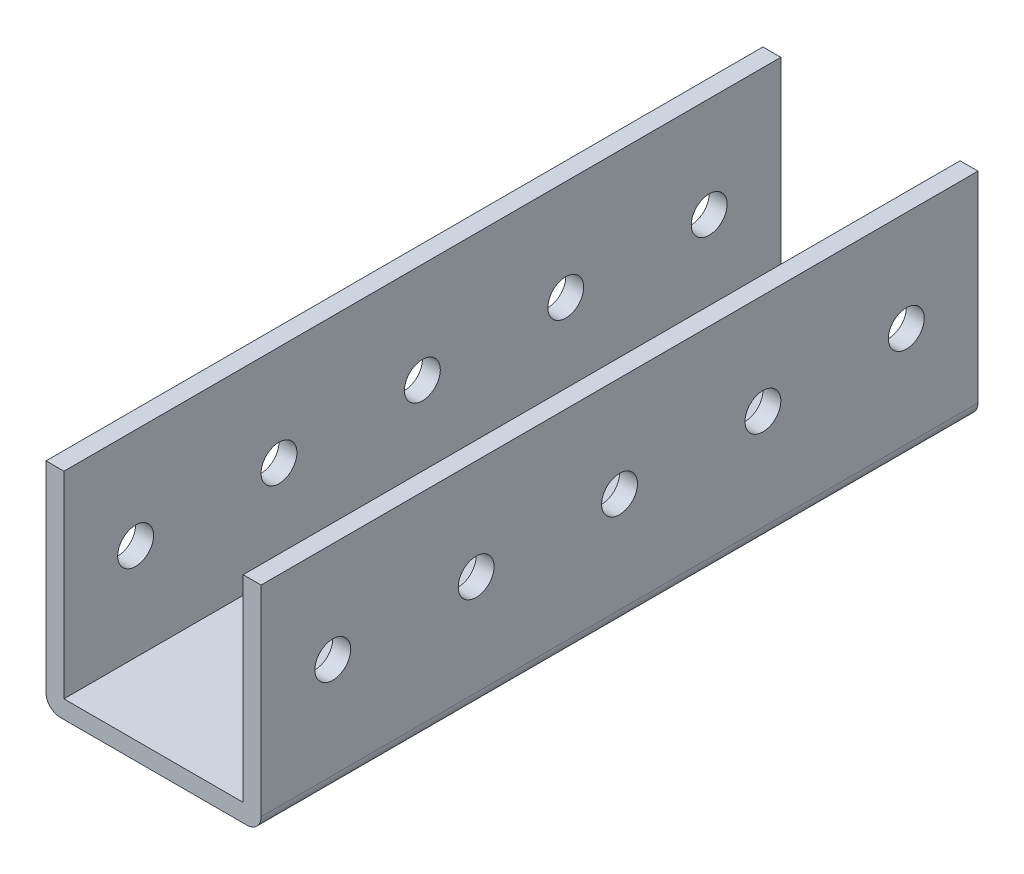
ISO-10303-21;
HEADER;
FILE_DESCRIPTION(('STEP AP214'),'2;1');
FILE_NAME('part.step','',(''),(''),'','','');
FILE_SCHEMA(('AUTOMOTIVE_DESIGN { 1 0 10303 214 1 1 1 1 }'));
ENDSEC;
DATA;
#1=APPLICATION_CONTEXT('core data for automotive mechanical design processes');
#2=APPLICATION_PROTOCOL_DEFINITION('international standard','automotive_design',2000,#1);
#3=PRODUCT_CONTEXT('',#1,'mechanical');
#4=PRODUCT('Part','Part','',(#3));
#5=PRODUCT_RELATED_PRODUCT_CATEGORY('part','',(#4));
#6=PRODUCT_DEFINITION_FORMATION('','',#4);
#7=PRODUCT_DEFINITION_CONTEXT('part definition',#1,'design');
#8=PRODUCT_DEFINITION('design','',#6,#7);
#9=PRODUCT_DEFINITION_SHAPE('','',#8);
#10=(LENGTH_UNIT() NAMED_UNIT(*) SI_UNIT(.MILLI.,.METRE.));
#11=(NAMED_UNIT(*) PLANE_ANGLE_UNIT() SI_UNIT($,.RADIAN.));
#12=(NAMED_UNIT(*) SI_UNIT($,.STERADIAN.) SOLID_ANGLE_UNIT());
#13=UNCERTAINTY_MEASURE_WITH_UNIT(LENGTH_MEASURE(1.E-05),#10,'distance_accuracy_value','');
#14=(GEOMETRIC_REPRESENTATION_CONTEXT(3) GLOBAL_UNCERTAINTY_ASSIGNED_CONTEXT((#13)) GLOBAL_UNIT_ASSIGNED_CONTEXT((#10,
#11,#12)) REPRESENTATION_CONTEXT('',''));
#15=CARTESIAN_POINT('',(0.,0.,0.));
#16=DIRECTION('',(0.,0.,1.));
#17=DIRECTION('',(1.,0.,0.));
#18=AXIS2_PLACEMENT_3D('',#15,#16,#17);
#19=CARTESIAN_POINT('',(0.,38.1,0.));
#20=DIRECTION('',(0.,-1.,0.));
#21=DIRECTION('',(0.,0.,-1.));
#22=AXIS2_PLACEMENT_3D('',#19,#20,#21);
#23=PLANE('',#22);
#24=DIRECTION('',(1.,0.,0.));
#25=VECTOR('',#24,1.);
#26=CARTESIAN_POINT('',(-19.05,38.1,63.5));
#27=LINE('',#26,#25);
#28=CARTESIAN_POINT('',(-19.05,38.1,63.5));
#29=VERTEX_POINT('',#28);
#30=CARTESIAN_POINT('',(-15.875,38.1,63.5));
#31=VERTEX_POINT('',#30);
#32=EDGE_CURVE('E164',#29,#31,#27,.T.);
#33=ORIENTED_EDGE('',*,*,#32,.T.);
#34=DIRECTION('',(0.,0.,-1.));
#35=VECTOR('',#34,1.);
#36=CARTESIAN_POINT('',(-15.875,38.1,0.));
#37=LINE('',#36,#35);
#38=CARTESIAN_POINT('',(-15.875,38.1,-63.5));
#39=VERTEX_POINT('',#38);
#40=EDGE_CURVE('E132',#31,#39,#37,.T.);
#41=ORIENTED_EDGE('',*,*,#40,.T.);
#42=DIRECTION('',(-1.,0.,0.));
#43=VECTOR('',#42,1.);
#44=CARTESIAN_POINT('',(-19.05,38.1,-63.5));
#45=LINE('',#44,#43);
#46=CARTESIAN_POINT('',(-19.05,38.1,-63.5));
#47=VERTEX_POINT('',#46);
#48=EDGE_CURVE('E156',#39,#47,#45,.T.);
#49=ORIENTED_EDGE('',*,*,#48,.T.);
#50=DIRECTION('',(0.,0.,1.));
#51=VECTOR('',#50,1.);
#52=CARTESIAN_POINT('',(-19.05,38.1,63.5));
#53=LINE('',#52,#51);
#54=EDGE_CURVE('E161',#47,#29,#53,.T.);
#55=ORIENTED_EDGE('',*,*,#54,.T.);
#56=EDGE_LOOP('',(#33,#41,#49,#55));
#57=FACE_BOUND('',#56,.T.);
#58=ADVANCED_FACE('F33',(#57),#23,.F.);
#59=CARTESIAN_POINT('',(19.05,38.1,63.5));
#60=DIRECTION('',(-1.,0.,0.));
#61=DIRECTION('',(0.,0.,1.));
#62=AXIS2_PLACEMENT_3D('',#59,#60,#61);
#63=PLANE('',#62);
#64=CARTESIAN_POINT('',(19.05,20.32,-50.8));
#65=DIRECTION('',(1.,0.,0.));
#66=DIRECTION('',(0.,0.,-1.));
#67=AXIS2_PLACEMENT_3D('',#64,#65,#66);
#68=CIRCLE('',#67,3.175);
#69=CARTESIAN_POINT('',(19.05,20.32,-53.975));
#70=VERTEX_POINT('',#69);
#71=EDGE_CURVE('E482',#70,#70,#68,.T.);
#72=ORIENTED_EDGE('',*,*,#71,.F.);
#73=EDGE_LOOP('',(#72));
#74=FACE_BOUND('',#73,.T.);
#75=CARTESIAN_POINT('',(19.05,20.32,-25.4));
#76=DIRECTION('',(1.,0.,0.));
#77=DIRECTION('',(0.,0.,-1.));
#78=AXIS2_PLACEMENT_3D('',#75,#76,#77);
#79=CIRCLE('',#78,3.175);
#80=CARTESIAN_POINT('',(19.05,20.32,-28.575));
#81=VERTEX_POINT('',#80);
#82=EDGE_CURVE('E213',#81,#81,#79,.T.);
#83=ORIENTED_EDGE('',*,*,#82,.F.);
#84=EDGE_LOOP('',(#83));
#85=FACE_BOUND('',#84,.T.);
#86=CARTESIAN_POINT('',(19.05,20.32,0.));
#87=DIRECTION('',(1.,0.,0.));
#88=DIRECTION('',(0.,0.,-1.));
#89=AXIS2_PLACEMENT_3D('',#86,#87,#88);
#90=CIRCLE('',#89,3.175);
#91=CARTESIAN_POINT('',(19.05,20.32,-3.17499999999998));
#92=VERTEX_POINT('',#91);
#93=EDGE_CURVE('E209',#92,#92,#90,.T.);
#94=ORIENTED_EDGE('',*,*,#93,.F.);
#95=EDGE_LOOP('',(#94));
#96=FACE_BOUND('',#95,.T.);
#97=CARTESIAN_POINT('',(19.05,20.32,25.4));
#98=DIRECTION('',(1.,0.,0.));
#99=DIRECTION('',(0.,0.,-1.));
#100=AXIS2_PLACEMENT_3D('',#97,#98,#99);
#101=CIRCLE('',#100,3.175);
#102=CARTESIAN_POINT('',(19.05,20.32,22.225));
#103=VERTEX_POINT('',#102);
#104=EDGE_CURVE('E205',#103,#103,#101,.T.);
#105=ORIENTED_EDGE('',*,*,#104,.F.);
#106=EDGE_LOOP('',(#105));
#107=FACE_BOUND('',#106,.T.);
#108=CARTESIAN_POINT('',(19.05,20.32,50.8));
#109=DIRECTION('',(1.,0.,0.));
#110=DIRECTION('',(0.,0.,-1.));
#111=AXIS2_PLACEMENT_3D('',#108,#109,#110);
#112=CIRCLE('',#111,3.175);
#113=CARTESIAN_POINT('',(19.05,20.32,47.625));
#114=VERTEX_POINT('',#113);
#115=EDGE_CURVE('E200',#114,#114,#112,.T.);
#116=ORIENTED_EDGE('',*,*,#115,.F.);
#117=EDGE_LOOP('',(#116));
#118=FACE_BOUND('',#117,.T.);
#119=DIRECTION('',(0.,-1.,0.));
#120=VECTOR('',#119,1.);
#121=CARTESIAN_POINT('',(19.05,38.1,63.5));
#122=LINE('',#121,#120);
#123=CARTESIAN_POINT('',(19.05,38.1,63.5));
#124=VERTEX_POINT('',#123);
#125=CARTESIAN_POINT('',(19.05,2.54000000000001,63.5));
#126=VERTEX_POINT('',#125);
#127=EDGE_CURVE('E166',#124,#126,#122,.T.);
#128=ORIENTED_EDGE('',*,*,#127,.T.);
#129=DIRECTION('',(0.,0.,-1.));
#130=VECTOR('',#129,1.);
#131=CARTESIAN_POINT('',(19.05,2.54,-63.5));
#132=LINE('',#131,#130);
#133=CARTESIAN_POINT('',(19.05,2.54000000000001,-63.5));
#134=VERTEX_POINT('',#133);
#135=EDGE_CURVE('E11',#126,#134,#132,.T.);
#136=ORIENTED_EDGE('',*,*,#135,.T.);
#137=DIRECTION('',(0.,-1.,0.));
#138=VECTOR('',#137,1.);
#139=CARTESIAN_POINT('',(19.05,38.1,-63.5));
#140=LINE('',#139,#138);
#141=CARTESIAN_POINT('',(19.05,38.1,-63.5));
#142=VERTEX_POINT('',#141);
#143=EDGE_CURVE('E177',#142,#134,#140,.T.);
#144=ORIENTED_EDGE('',*,*,#143,.F.);
#145=DIRECTION('',(0.,0.,-1.));
#146=VECTOR('',#145,1.);
#147=CARTESIAN_POINT('',(19.05,38.1,63.5));
#148=LINE('',#147,#146);
#149=EDGE_CURVE('E153',#124,#142,#148,.T.);
#150=ORIENTED_EDGE('',*,*,#149,.F.);
#151=EDGE_LOOP('',(#128,#136,#144,#150));
#152=FACE_BOUND('',#151,.T.);
#153=ADVANCED_FACE('F271',(#74,#85,#96,#107,#118,#152),#63,.F.);
#154=CARTESIAN_POINT('',(-19.05,38.1,-63.5));
#155=DIRECTION('',(0.,0.,1.));
#156=DIRECTION('',(1.,0.,0.));
#157=AXIS2_PLACEMENT_3D('',#154,#155,#156);
#158=PLANE('',#157);
#159=DIRECTION('',(-1.,0.,0.));
#160=VECTOR('',#159,1.);
#161=CARTESIAN_POINT('',(-19.05,0.,-63.5));
#162=LINE('',#161,#160);
#163=CARTESIAN_POINT('',(16.51,0.,-63.5));
#164=VERTEX_POINT('',#163);
#165=CARTESIAN_POINT('',(-16.51,0.,-63.5));
#166=VERTEX_POINT('',#165);
#167=EDGE_CURVE('E152',#164,#166,#162,.T.);
#168=ORIENTED_EDGE('',*,*,#167,.T.);
#169=CARTESIAN_POINT('',(-16.51,2.54,-63.5));
#170=DIRECTION('',(0.,0.,1.));
#171=DIRECTION('',(1.,0.,0.));
#172=AXIS2_PLACEMENT_3D('',#169,#170,#171);
#173=CIRCLE('',#172,2.54);
#174=CARTESIAN_POINT('',(-19.05,2.54000000000001,-63.5));
#175=VERTEX_POINT('',#174);
#176=EDGE_CURVE('E42',#166,#175,#173,.F.);
#177=ORIENTED_EDGE('',*,*,#176,.T.);
#178=DIRECTION('',(0.,-1.,0.));
#179=VECTOR('',#178,1.);
#180=CARTESIAN_POINT('',(-19.05,38.1,-63.5));
#181=LINE('',#180,#179);
#182=EDGE_CURVE('E174',#47,#175,#181,.T.);
#183=ORIENTED_EDGE('',*,*,#182,.F.);
#184=ORIENTED_EDGE('',*,*,#48,.F.);
#185=DIRECTION('',(0.,-1.,0.));
#186=VECTOR('',#185,1.);
#187=CARTESIAN_POINT('',(-15.875,38.1,-63.5));
#188=LINE('',#187,#186);
#189=CARTESIAN_POINT('',(-15.875,3.175,-63.5));
#190=VERTEX_POINT('',#189);
#191=EDGE_CURVE('E149',#39,#190,#188,.T.);
#192=ORIENTED_EDGE('',*,*,#191,.T.);
#193=DIRECTION('',(1.,0.,0.));
#194=VECTOR('',#193,1.);
#195=CARTESIAN_POINT('',(-19.05,3.175,-63.5));
#196=LINE('',#195,#194);
#197=CARTESIAN_POINT('',(15.875,3.175,-63.5));
#198=VERTEX_POINT('',#197);
#199=EDGE_CURVE('E122',#190,#198,#196,.T.);
#200=ORIENTED_EDGE('',*,*,#199,.T.);
#201=DIRECTION('',(0.,1.,0.));
#202=VECTOR('',#201,1.);
#203=CARTESIAN_POINT('',(15.875,38.1,-63.5));
#204=LINE('',#203,#202);
#205=CARTESIAN_POINT('',(15.875,38.1,-63.5));
#206=VERTEX_POINT('',#205);
#207=EDGE_CURVE('E145',#198,#206,#204,.T.);
#208=ORIENTED_EDGE('',*,*,#207,.T.);
#209=EDGE_CURVE('E158',#142,#206,#45,.T.);
#210=ORIENTED_EDGE('',*,*,#209,.F.);
#211=ORIENTED_EDGE('',*,*,#143,.T.);
#212=CARTESIAN_POINT('',(16.51,2.54,-63.5));
#213=DIRECTION('',(0.,0.,1.));
#214=DIRECTION('',(1.,0.,0.));
#215=AXIS2_PLACEMENT_3D('',#212,#213,#214);
#216=CIRCLE('',#215,2.54);
#217=EDGE_CURVE('E50',#134,#164,#216,.F.);
#218=ORIENTED_EDGE('',*,*,#217,.T.);
#219=EDGE_LOOP('',(#168,#177,#183,#184,#192,#200,#208,#210,#211,#218));
#220=FACE_BOUND('',#219,.T.);
#221=ADVANCED_FACE('F278',(#220),#158,.F.);
#222=CARTESIAN_POINT('',(-19.05,38.1,63.5));
#223=DIRECTION('',(1.,0.,0.));
#224=DIRECTION('',(0.,0.,-1.));
#225=AXIS2_PLACEMENT_3D('',#222,#223,#224);
#226=PLANE('',#225);
#227=CARTESIAN_POINT('',(-19.05,20.32,-50.8));
#228=DIRECTION('',(1.,0.,0.));
#229=DIRECTION('',(0.,0.,-1.));
#230=AXIS2_PLACEMENT_3D('',#227,#228,#229);
#231=CIRCLE('',#230,3.175);
#232=CARTESIAN_POINT('',(-19.05,20.32,-53.975));
#233=VERTEX_POINT('',#232);
#234=EDGE_CURVE('E220',#233,#233,#231,.T.);
#235=ORIENTED_EDGE('',*,*,#234,.T.);
#236=EDGE_LOOP('',(#235));
#237=FACE_BOUND('',#236,.T.);
#238=CARTESIAN_POINT('',(-19.05,20.32,-25.4));
#239=DIRECTION('',(1.,0.,0.));
#240=DIRECTION('',(0.,0.,-1.));
#241=AXIS2_PLACEMENT_3D('',#238,#239,#240);
#242=CIRCLE('',#241,3.175);
#243=CARTESIAN_POINT('',(-19.05,20.32,-28.575));
#244=VERTEX_POINT('',#243);
#245=EDGE_CURVE('E217',#244,#244,#242,.T.);
#246=ORIENTED_EDGE('',*,*,#245,.T.);
#247=EDGE_LOOP('',(#246));
#248=FACE_BOUND('',#247,.T.);
#249=CARTESIAN_POINT('',(-19.05,20.32,0.));
#250=DIRECTION('',(1.,0.,0.));
#251=DIRECTION('',(0.,0.,-1.));
#252=AXIS2_PLACEMENT_3D('',#249,#250,#251);
#253=CIRCLE('',#252,3.175);
#254=CARTESIAN_POINT('',(-19.05,20.32,-3.17499999999998));
#255=VERTEX_POINT('',#254);
#256=EDGE_CURVE('E235',#255,#255,#253,.T.);
#257=ORIENTED_EDGE('',*,*,#256,.T.);
#258=EDGE_LOOP('',(#257));
#259=FACE_BOUND('',#258,.T.);
#260=CARTESIAN_POINT('',(-19.05,20.32,25.4));
#261=DIRECTION('',(1.,0.,0.));
#262=DIRECTION('',(0.,0.,-1.));
#263=AXIS2_PLACEMENT_3D('',#260,#261,#262);
#264=CIRCLE('',#263,3.175);
#265=CARTESIAN_POINT('',(-19.05,20.32,22.225));
#266=VERTEX_POINT('',#265);
#267=EDGE_CURVE('E242',#266,#266,#264,.T.);
#268=ORIENTED_EDGE('',*,*,#267,.T.);
#269=EDGE_LOOP('',(#268));
#270=FACE_BOUND('',#269,.T.);
#271=CARTESIAN_POINT('',(-19.05,20.32,50.8));
#272=DIRECTION('',(1.,0.,0.));
#273=DIRECTION('',(0.,0.,-1.));
#274=AXIS2_PLACEMENT_3D('',#271,#272,#273);
#275=CIRCLE('',#274,3.175);
#276=CARTESIAN_POINT('',(-19.05,20.32,47.625));
#277=VERTEX_POINT('',#276);
#278=EDGE_CURVE('E136',#277,#277,#275,.T.);
#279=ORIENTED_EDGE('',*,*,#278,.T.);
#280=EDGE_LOOP('',(#279));
#281=FACE_BOUND('',#280,.T.);
#282=ORIENTED_EDGE('',*,*,#182,.T.);
#283=DIRECTION('',(0.,0.,1.));
#284=VECTOR('',#283,1.);
#285=CARTESIAN_POINT('',(-19.05,2.54,63.5));
#286=LINE('',#285,#284);
#287=CARTESIAN_POINT('',(-19.05,2.54000000000001,63.5));
#288=VERTEX_POINT('',#287);
#289=EDGE_CURVE('E184',#175,#288,#286,.T.);
#290=ORIENTED_EDGE('',*,*,#289,.T.);
#291=DIRECTION('',(0.,-1.,0.));
#292=VECTOR('',#291,1.);
#293=CARTESIAN_POINT('',(-19.05,38.1,63.5));
#294=LINE('',#293,#292);
#295=EDGE_CURVE('E172',#29,#288,#294,.T.);
#296=ORIENTED_EDGE('',*,*,#295,.F.);
#297=ORIENTED_EDGE('',*,*,#54,.F.);
#298=EDGE_LOOP('',(#282,#290,#296,#297));
#299=FACE_BOUND('',#298,.T.);
#300=ADVANCED_FACE('F251',(#237,#248,#259,#270,#281,#299),#226,.F.);
#301=CARTESIAN_POINT('',(-19.05,38.1,63.5));
#302=DIRECTION('',(0.,0.,-1.));
#303=DIRECTION('',(-1.,0.,0.));
#304=AXIS2_PLACEMENT_3D('',#301,#302,#303);
#305=PLANE('',#304);
#306=ORIENTED_EDGE('',*,*,#295,.T.);
#307=CARTESIAN_POINT('',(-16.51,2.54,63.5));
#308=DIRECTION('',(0.,0.,-1.));
#309=DIRECTION('',(-1.,0.,0.));
#310=AXIS2_PLACEMENT_3D('',#307,#308,#309);
#311=CIRCLE('',#310,2.54);
#312=CARTESIAN_POINT('',(-16.51,0.,63.5));
#313=VERTEX_POINT('',#312);
#314=EDGE_CURVE('E189',#288,#313,#311,.F.);
#315=ORIENTED_EDGE('',*,*,#314,.T.);
#316=DIRECTION('',(1.,0.,0.));
#317=VECTOR('',#316,1.);
#318=CARTESIAN_POINT('',(-19.05,0.,63.5));
#319=LINE('',#318,#317);
#320=CARTESIAN_POINT('',(16.51,0.,63.5));
#321=VERTEX_POINT('',#320);
#322=EDGE_CURVE('E157',#313,#321,#319,.T.);
#323=ORIENTED_EDGE('',*,*,#322,.T.);
#324=CARTESIAN_POINT('',(16.51,2.54,63.5));
#325=DIRECTION('',(0.,0.,-1.));
#326=DIRECTION('',(-1.,0.,0.));
#327=AXIS2_PLACEMENT_3D('',#324,#325,#326);
#328=CIRCLE('',#327,2.54);
#329=EDGE_CURVE('E187',#321,#126,#328,.F.);
#330=ORIENTED_EDGE('',*,*,#329,.T.);
#331=ORIENTED_EDGE('',*,*,#127,.F.);
#332=CARTESIAN_POINT('',(15.875,38.1,63.5));
#333=VERTEX_POINT('',#332);
#334=EDGE_CURVE('E163',#333,#124,#27,.T.);
#335=ORIENTED_EDGE('',*,*,#334,.F.);
#336=DIRECTION('',(0.,1.,0.));
#337=VECTOR('',#336,1.);
#338=CARTESIAN_POINT('',(15.875,38.1,63.5));
#339=LINE('',#338,#337);
#340=CARTESIAN_POINT('',(15.875,3.175,63.5));
#341=VERTEX_POINT('',#340);
#342=EDGE_CURVE('E126',#341,#333,#339,.T.);
#343=ORIENTED_EDGE('',*,*,#342,.F.);
#344=DIRECTION('',(1.,0.,0.));
#345=VECTOR('',#344,1.);
#346=CARTESIAN_POINT('',(-15.875,3.175,63.5));
#347=LINE('',#346,#345);
#348=CARTESIAN_POINT('',(-15.875,3.175,63.5));
#349=VERTEX_POINT('',#348);
#350=EDGE_CURVE('E119',#349,#341,#347,.T.);
#351=ORIENTED_EDGE('',*,*,#350,.F.);
#352=DIRECTION('',(0.,-1.,0.));
#353=VECTOR('',#352,1.);
#354=CARTESIAN_POINT('',(-15.875,38.1,63.5));
#355=LINE('',#354,#353);
#356=EDGE_CURVE('E129',#31,#349,#355,.T.);
#357=ORIENTED_EDGE('',*,*,#356,.F.);
#358=ORIENTED_EDGE('',*,*,#32,.F.);
#359=EDGE_LOOP('',(#306,#315,#323,#330,#331,#335,#343,#351,#357,#358));
#360=FACE_BOUND('',#359,.T.);
#361=ADVANCED_FACE('F139',(#360),#305,.F.);
#362=ORIENTED_EDGE('',*,*,#209,.T.);
#363=DIRECTION('',(0.,0.,1.));
#364=VECTOR('',#363,1.);
#365=CARTESIAN_POINT('',(15.875,38.1,0.));
#366=LINE('',#365,#364);
#367=EDGE_CURVE('E180',#206,#333,#366,.T.);
#368=ORIENTED_EDGE('',*,*,#367,.T.);
#369=ORIENTED_EDGE('',*,*,#334,.T.);
#370=ORIENTED_EDGE('',*,*,#149,.T.);
#371=EDGE_LOOP('',(#362,#368,#369,#370));
#372=FACE_BOUND('',#371,.T.);
#373=ADVANCED_FACE('F274',(#372),#23,.F.);
#374=CARTESIAN_POINT('',(0.,0.,0.));
#375=DIRECTION('',(0.,-1.,0.));
#376=DIRECTION('',(0.,0.,-1.));
#377=AXIS2_PLACEMENT_3D('',#374,#375,#376);
#378=PLANE('',#377);
#379=ORIENTED_EDGE('',*,*,#322,.F.);
#380=DIRECTION('',(0.,0.,1.));
#381=VECTOR('',#380,1.);
#382=CARTESIAN_POINT('',(-16.51,0.,-63.5));
#383=LINE('',#382,#381);
#384=EDGE_CURVE('E57',#313,#166,#383,.F.);
#385=ORIENTED_EDGE('',*,*,#384,.T.);
#386=ORIENTED_EDGE('',*,*,#167,.F.);
#387=DIRECTION('',(0.,0.,-1.));
#388=VECTOR('',#387,1.);
#389=CARTESIAN_POINT('',(16.51,0.,63.5));
#390=LINE('',#389,#388);
#391=EDGE_CURVE('E191',#164,#321,#390,.F.);
#392=ORIENTED_EDGE('',*,*,#391,.T.);
#393=EDGE_LOOP('',(#379,#385,#386,#392));
#394=FACE_BOUND('',#393,.T.);
#395=ADVANCED_FACE('F284',(#394),#378,.T.);
#396=CARTESIAN_POINT('',(-15.875,3.175,-342.9));
#397=DIRECTION('',(0.,-1.,0.));
#398=DIRECTION('',(1.,0.,0.));
#399=AXIS2_PLACEMENT_3D('',#396,#397,#398);
#400=PLANE('',#399);
#401=DIRECTION('',(0.,0.,1.));
#402=VECTOR('',#401,1.);
#403=CARTESIAN_POINT('',(-15.875,3.175,-342.9));
#404=LINE('',#403,#402);
#405=EDGE_CURVE('E114',#190,#349,#404,.T.);
#406=ORIENTED_EDGE('',*,*,#405,.T.);
#407=ORIENTED_EDGE('',*,*,#350,.T.);
#408=DIRECTION('',(0.,0.,1.));
#409=VECTOR('',#408,1.);
#410=CARTESIAN_POINT('',(15.875,3.175,-342.9));
#411=LINE('',#410,#409);
#412=EDGE_CURVE('E125',#198,#341,#411,.T.);
#413=ORIENTED_EDGE('',*,*,#412,.F.);
#414=ORIENTED_EDGE('',*,*,#199,.F.);
#415=EDGE_LOOP('',(#406,#407,#413,#414));
#416=FACE_BOUND('',#415,.T.);
#417=ADVANCED_FACE('F116',(#416),#400,.F.);
#418=CARTESIAN_POINT('',(-15.875,38.1,-342.9));
#419=DIRECTION('',(-1.,0.,0.));
#420=DIRECTION('',(0.,-1.,0.));
#421=AXIS2_PLACEMENT_3D('',#418,#419,#420);
#422=PLANE('',#421);
#423=CARTESIAN_POINT('',(-15.875,20.32,-50.8));
#424=DIRECTION('',(-1.,0.,0.));
#425=DIRECTION('',(0.,-1.,0.));
#426=AXIS2_PLACEMENT_3D('',#423,#424,#425);
#427=CIRCLE('',#426,3.175);
#428=CARTESIAN_POINT('',(-15.875,17.145,-50.8));
#429=VERTEX_POINT('',#428);
#430=EDGE_CURVE('E225',#429,#429,#427,.T.);
#431=ORIENTED_EDGE('',*,*,#430,.T.);
#432=EDGE_LOOP('',(#431));
#433=FACE_BOUND('',#432,.T.);
#434=CARTESIAN_POINT('',(-15.875,20.32,-25.4));
#435=DIRECTION('',(-1.,0.,0.));
#436=DIRECTION('',(0.,-1.,0.));
#437=AXIS2_PLACEMENT_3D('',#434,#435,#436);
#438=CIRCLE('',#437,3.175);
#439=CARTESIAN_POINT('',(-15.875,17.145,-25.4));
#440=VERTEX_POINT('',#439);
#441=EDGE_CURVE('E212',#440,#440,#438,.T.);
#442=ORIENTED_EDGE('',*,*,#441,.T.);
#443=EDGE_LOOP('',(#442));
#444=FACE_BOUND('',#443,.T.);
#445=CARTESIAN_POINT('',(-15.875,20.32,0.));
#446=DIRECTION('',(-1.,0.,0.));
#447=DIRECTION('',(0.,-1.,0.));
#448=AXIS2_PLACEMENT_3D('',#445,#446,#447);
#449=CIRCLE('',#448,3.175);
#450=CARTESIAN_POINT('',(-15.875,17.145,0.));
#451=VERTEX_POINT('',#450);
#452=EDGE_CURVE('E208',#451,#451,#449,.T.);
#453=ORIENTED_EDGE('',*,*,#452,.T.);
#454=EDGE_LOOP('',(#453));
#455=FACE_BOUND('',#454,.T.);
#456=CARTESIAN_POINT('',(-15.875,20.32,25.4));
#457=DIRECTION('',(-1.,0.,0.));
#458=DIRECTION('',(0.,-1.,0.));
#459=AXIS2_PLACEMENT_3D('',#456,#457,#458);
#460=CIRCLE('',#459,3.175);
#461=CARTESIAN_POINT('',(-15.875,17.145,25.4));
#462=VERTEX_POINT('',#461);
#463=EDGE_CURVE('E204',#462,#462,#460,.T.);
#464=ORIENTED_EDGE('',*,*,#463,.T.);
#465=EDGE_LOOP('',(#464));
#466=FACE_BOUND('',#465,.T.);
#467=CARTESIAN_POINT('',(-15.875,20.32,50.8));
#468=DIRECTION('',(-1.,0.,0.));
#469=DIRECTION('',(0.,-1.,0.));
#470=AXIS2_PLACEMENT_3D('',#467,#468,#469);
#471=CIRCLE('',#470,3.175);
#472=CARTESIAN_POINT('',(-15.875,17.145,50.8));
#473=VERTEX_POINT('',#472);
#474=EDGE_CURVE('E199',#473,#473,#471,.T.);
#475=ORIENTED_EDGE('',*,*,#474,.T.);
#476=EDGE_LOOP('',(#475));
#477=FACE_BOUND('',#476,.T.);
#478=ORIENTED_EDGE('',*,*,#40,.F.);
#479=ORIENTED_EDGE('',*,*,#356,.T.);
#480=ORIENTED_EDGE('',*,*,#405,.F.);
#481=ORIENTED_EDGE('',*,*,#191,.F.);
#482=EDGE_LOOP('',(#478,#479,#480,#481));
#483=FACE_BOUND('',#482,.T.);
#484=ADVANCED_FACE('F130',(#433,#444,#455,#466,#477,#483),#422,.F.);
#485=CARTESIAN_POINT('',(15.875,38.1,-342.9));
#486=DIRECTION('',(1.,0.,0.));
#487=DIRECTION('',(0.,1.,0.));
#488=AXIS2_PLACEMENT_3D('',#485,#486,#487);
#489=PLANE('',#488);
#490=CARTESIAN_POINT('',(15.875,20.32,-50.8));
#491=DIRECTION('',(1.,0.,0.));
#492=DIRECTION('',(0.,1.,0.));
#493=AXIS2_PLACEMENT_3D('',#490,#491,#492);
#494=CIRCLE('',#493,3.175);
#495=CARTESIAN_POINT('',(15.875,23.495,-50.8));
#496=VERTEX_POINT('',#495);
#497=EDGE_CURVE('E37',#496,#496,#494,.T.);
#498=ORIENTED_EDGE('',*,*,#497,.T.);
#499=EDGE_LOOP('',(#498));
#500=FACE_BOUND('',#499,.T.);
#501=CARTESIAN_POINT('',(15.875,20.32,-25.4));
#502=DIRECTION('',(1.,0.,0.));
#503=DIRECTION('',(0.,1.,0.));
#504=AXIS2_PLACEMENT_3D('',#501,#502,#503);
#505=CIRCLE('',#504,3.175);
#506=CARTESIAN_POINT('',(15.875,23.495,-25.4));
#507=VERTEX_POINT('',#506);
#508=EDGE_CURVE('E210',#507,#507,#505,.T.);
#509=ORIENTED_EDGE('',*,*,#508,.T.);
#510=EDGE_LOOP('',(#509));
#511=FACE_BOUND('',#510,.T.);
#512=CARTESIAN_POINT('',(15.875,20.32,0.));
#513=DIRECTION('',(1.,0.,0.));
#514=DIRECTION('',(0.,1.,0.));
#515=AXIS2_PLACEMENT_3D('',#512,#513,#514);
#516=CIRCLE('',#515,3.175);
#517=CARTESIAN_POINT('',(15.875,23.495,0.));
#518=VERTEX_POINT('',#517);
#519=EDGE_CURVE('E206',#518,#518,#516,.T.);
#520=ORIENTED_EDGE('',*,*,#519,.T.);
#521=EDGE_LOOP('',(#520));
#522=FACE_BOUND('',#521,.T.);
#523=CARTESIAN_POINT('',(15.875,20.32,25.4));
#524=DIRECTION('',(1.,0.,0.));
#525=DIRECTION('',(0.,1.,0.));
#526=AXIS2_PLACEMENT_3D('',#523,#524,#525);
#527=CIRCLE('',#526,3.175);
#528=CARTESIAN_POINT('',(15.875,23.495,25.4));
#529=VERTEX_POINT('',#528);
#530=EDGE_CURVE('E201',#529,#529,#527,.T.);
#531=ORIENTED_EDGE('',*,*,#530,.T.);
#532=EDGE_LOOP('',(#531));
#533=FACE_BOUND('',#532,.T.);
#534=CARTESIAN_POINT('',(15.875,20.32,50.8));
#535=DIRECTION('',(1.,0.,0.));
#536=DIRECTION('',(0.,1.,0.));
#537=AXIS2_PLACEMENT_3D('',#534,#535,#536);
#538=CIRCLE('',#537,3.175);
#539=CARTESIAN_POINT('',(15.875,23.495,50.8));
#540=VERTEX_POINT('',#539);
#541=EDGE_CURVE('E196',#540,#540,#538,.T.);
#542=ORIENTED_EDGE('',*,*,#541,.T.);
#543=EDGE_LOOP('',(#542));
#544=FACE_BOUND('',#543,.T.);
#545=ORIENTED_EDGE('',*,*,#412,.T.);
#546=ORIENTED_EDGE('',*,*,#342,.T.);
#547=ORIENTED_EDGE('',*,*,#367,.F.);
#548=ORIENTED_EDGE('',*,*,#207,.F.);
#549=EDGE_LOOP('',(#545,#546,#547,#548));
#550=FACE_BOUND('',#549,.T.);
#551=ADVANCED_FACE('F295',(#500,#511,#522,#533,#544,#550),#489,.F.);
#552=CARTESIAN_POINT('',(-16.51,2.54,63.5));
#553=DIRECTION('',(0.,0.,-1.));
#554=DIRECTION('',(-1.,0.,0.));
#555=AXIS2_PLACEMENT_3D('',#552,#553,#554);
#556=CYLINDRICAL_SURFACE('',#555,2.54);
#557=ORIENTED_EDGE('',*,*,#176,.F.);
#558=ORIENTED_EDGE('',*,*,#384,.F.);
#559=ORIENTED_EDGE('',*,*,#314,.F.);
#560=ORIENTED_EDGE('',*,*,#289,.F.);
#561=EDGE_LOOP('',(#557,#558,#559,#560));
#562=FACE_BOUND('',#561,.T.);
#563=ADVANCED_FACE('F297',(#562),#556,.T.);
#564=CARTESIAN_POINT('',(16.51,2.54,63.5));
#565=DIRECTION('',(0.,0.,1.));
#566=DIRECTION('',(1.,0.,0.));
#567=AXIS2_PLACEMENT_3D('',#564,#565,#566);
#568=CYLINDRICAL_SURFACE('',#567,2.54);
#569=ORIENTED_EDGE('',*,*,#329,.F.);
#570=ORIENTED_EDGE('',*,*,#391,.F.);
#571=ORIENTED_EDGE('',*,*,#217,.F.);
#572=ORIENTED_EDGE('',*,*,#135,.F.);
#573=EDGE_LOOP('',(#569,#570,#571,#572));
#574=FACE_BOUND('',#573,.T.);
#575=ADVANCED_FACE('F35',(#574),#568,.T.);
#576=CARTESIAN_POINT('',(-31.75,20.32,50.8));
#577=DIRECTION('',(1.,0.,0.));
#578=DIRECTION('',(0.,0.,-1.));
#579=AXIS2_PLACEMENT_3D('',#576,#577,#578);
#580=CYLINDRICAL_SURFACE('',#579,3.175);
#581=ORIENTED_EDGE('',*,*,#115,.T.);
#582=EDGE_LOOP('',(#581));
#583=FACE_BOUND('',#582,.T.);
#584=ORIENTED_EDGE('',*,*,#541,.F.);
#585=EDGE_LOOP('',(#584));
#586=FACE_BOUND('',#585,.T.);
#587=ADVANCED_FACE('F257',(#583,#586),#580,.F.);
#588=ORIENTED_EDGE('',*,*,#474,.F.);
#589=EDGE_LOOP('',(#588));
#590=FACE_BOUND('',#589,.T.);
#591=ORIENTED_EDGE('',*,*,#278,.F.);
#592=EDGE_LOOP('',(#591));
#593=FACE_BOUND('',#592,.T.);
#594=ADVANCED_FACE('F254',(#590,#593),#580,.F.);
#595=CARTESIAN_POINT('',(-31.75,20.32,25.4));
#596=DIRECTION('',(1.,0.,0.));
#597=DIRECTION('',(0.,0.,-1.));
#598=AXIS2_PLACEMENT_3D('',#595,#596,#597);
#599=CYLINDRICAL_SURFACE('',#598,3.175);
#600=ORIENTED_EDGE('',*,*,#104,.T.);
#601=EDGE_LOOP('',(#600));
#602=FACE_BOUND('',#601,.T.);
#603=ORIENTED_EDGE('',*,*,#530,.F.);
#604=EDGE_LOOP('',(#603));
#605=FACE_BOUND('',#604,.T.);
#606=ADVANCED_FACE('F256',(#602,#605),#599,.F.);
#607=ORIENTED_EDGE('',*,*,#463,.F.);
#608=EDGE_LOOP('',(#607));
#609=FACE_BOUND('',#608,.T.);
#610=ORIENTED_EDGE('',*,*,#267,.F.);
#611=EDGE_LOOP('',(#610));
#612=FACE_BOUND('',#611,.T.);
#613=ADVANCED_FACE('F264',(#609,#612),#599,.F.);
#614=CARTESIAN_POINT('',(-31.75,20.32,0.));
#615=DIRECTION('',(1.,0.,0.));
#616=DIRECTION('',(0.,0.,-1.));
#617=AXIS2_PLACEMENT_3D('',#614,#615,#616);
#618=CYLINDRICAL_SURFACE('',#617,3.175);
#619=ORIENTED_EDGE('',*,*,#93,.T.);
#620=EDGE_LOOP('',(#619));
#621=FACE_BOUND('',#620,.T.);
#622=ORIENTED_EDGE('',*,*,#519,.F.);
#623=EDGE_LOOP('',(#622));
#624=FACE_BOUND('',#623,.T.);
#625=ADVANCED_FACE('F354',(#621,#624),#618,.F.);
#626=ORIENTED_EDGE('',*,*,#452,.F.);
#627=EDGE_LOOP('',(#626));
#628=FACE_BOUND('',#627,.T.);
#629=ORIENTED_EDGE('',*,*,#256,.F.);
#630=EDGE_LOOP('',(#629));
#631=FACE_BOUND('',#630,.T.);
#632=ADVANCED_FACE('F363',(#628,#631),#618,.F.);
#633=CARTESIAN_POINT('',(-31.75,20.32,-25.4));
#634=DIRECTION('',(1.,0.,0.));
#635=DIRECTION('',(0.,0.,-1.));
#636=AXIS2_PLACEMENT_3D('',#633,#634,#635);
#637=CYLINDRICAL_SURFACE('',#636,3.175);
#638=ORIENTED_EDGE('',*,*,#82,.T.);
#639=EDGE_LOOP('',(#638));
#640=FACE_BOUND('',#639,.T.);
#641=ORIENTED_EDGE('',*,*,#508,.F.);
#642=EDGE_LOOP('',(#641));
#643=FACE_BOUND('',#642,.T.);
#644=ADVANCED_FACE('F373',(#640,#643),#637,.F.);
#645=ORIENTED_EDGE('',*,*,#441,.F.);
#646=EDGE_LOOP('',(#645));
#647=FACE_BOUND('',#646,.T.);
#648=ORIENTED_EDGE('',*,*,#245,.F.);
#649=EDGE_LOOP('',(#648));
#650=FACE_BOUND('',#649,.T.);
#651=ADVANCED_FACE('F382',(#647,#650),#637,.F.);
#652=CARTESIAN_POINT('',(-31.75,20.32,-50.8));
#653=DIRECTION('',(1.,0.,0.));
#654=DIRECTION('',(0.,0.,-1.));
#655=AXIS2_PLACEMENT_3D('',#652,#653,#654);
#656=CYLINDRICAL_SURFACE('',#655,3.175);
#657=ORIENTED_EDGE('',*,*,#71,.T.);
#658=EDGE_LOOP('',(#657));
#659=FACE_BOUND('',#658,.T.);
#660=ORIENTED_EDGE('',*,*,#497,.F.);
#661=EDGE_LOOP('',(#660));
#662=FACE_BOUND('',#661,.T.);
#663=ADVANCED_FACE('F391',(#659,#662),#656,.F.);
#664=ORIENTED_EDGE('',*,*,#430,.F.);
#665=EDGE_LOOP('',(#664));
#666=FACE_BOUND('',#665,.T.);
#667=ORIENTED_EDGE('',*,*,#234,.F.);
#668=EDGE_LOOP('',(#667));
#669=FACE_BOUND('',#668,.T.);
#670=ADVANCED_FACE('F400',(#666,#669),#656,.F.);
#671=CLOSED_SHELL('',(#58,#153,#221,#300,#361,#373,#395,#417,#484,#551,#563,#575,#587,#594,#606,
#613,#625,#632,#644,#651,#663,#670));
#672=MANIFOLD_SOLID_BREP('B2',#671);
#673=ADVANCED_BREP_SHAPE_REPRESENTATION('',(#18,#672),#14);
#674=SHAPE_DEFINITION_REPRESENTATION(#9,#673);
ENDSEC;
END-ISO-10303-21;
